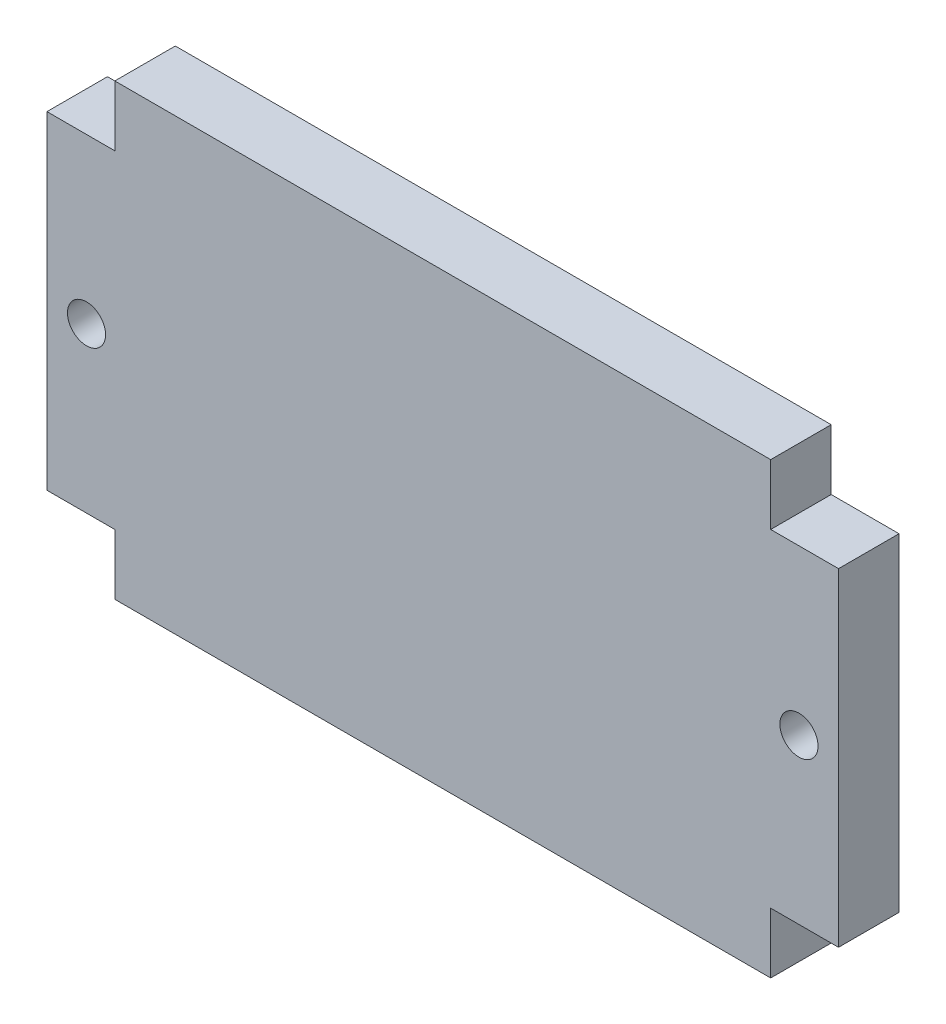
ISO-10303-21;
HEADER;
FILE_DESCRIPTION(('STEP AP214'),'2;1');
FILE_NAME('part.step','',(''),(''),'','','');
FILE_SCHEMA(('AUTOMOTIVE_DESIGN { 1 0 10303 214 1 1 1 1 }'));
ENDSEC;
DATA;
#1=APPLICATION_CONTEXT('core data for automotive mechanical design processes');
#2=APPLICATION_PROTOCOL_DEFINITION('international standard','automotive_design',2000,#1);
#3=PRODUCT_CONTEXT('',#1,'mechanical');
#4=PRODUCT('Part','Part','',(#3));
#5=PRODUCT_RELATED_PRODUCT_CATEGORY('part','',(#4));
#6=PRODUCT_DEFINITION_FORMATION('','',#4);
#7=PRODUCT_DEFINITION_CONTEXT('part definition',#1,'design');
#8=PRODUCT_DEFINITION('design','',#6,#7);
#9=PRODUCT_DEFINITION_SHAPE('','',#8);
#10=(LENGTH_UNIT() NAMED_UNIT(*) SI_UNIT(.MILLI.,.METRE.));
#11=(NAMED_UNIT(*) PLANE_ANGLE_UNIT() SI_UNIT($,.RADIAN.));
#12=(NAMED_UNIT(*) SI_UNIT($,.STERADIAN.) SOLID_ANGLE_UNIT());
#13=UNCERTAINTY_MEASURE_WITH_UNIT(LENGTH_MEASURE(1.E-05),#10,'distance_accuracy_value','');
#14=(GEOMETRIC_REPRESENTATION_CONTEXT(3) GLOBAL_UNCERTAINTY_ASSIGNED_CONTEXT((#13)) GLOBAL_UNIT_ASSIGNED_CONTEXT((#10,
#11,#12)) REPRESENTATION_CONTEXT('',''));
#15=CARTESIAN_POINT('',(0.,0.,0.));
#16=DIRECTION('',(0.,0.,1.));
#17=DIRECTION('',(1.,0.,0.));
#18=AXIS2_PLACEMENT_3D('',#15,#16,#17);
#19=CARTESIAN_POINT('',(0.,0.,5.35));
#20=DIRECTION('',(0.,0.,-1.));
#21=DIRECTION('',(-1.,0.,0.));
#22=AXIS2_PLACEMENT_3D('',#19,#20,#21);
#23=PLANE('',#22);
#24=DIRECTION('',(1.,0.,0.));
#25=VECTOR('',#24,1.);
#26=CARTESIAN_POINT('',(0.,5.3500011563,5.35));
#27=LINE('',#26,#25);
#28=CARTESIAN_POINT('',(0.,5.3500011563,5.35));
#29=VERTEX_POINT('',#28);
#30=CARTESIAN_POINT('',(5.99999725809999,5.3500011563,5.35));
#31=VERTEX_POINT('',#30);
#32=EDGE_CURVE('E177',#29,#31,#27,.T.);
#33=ORIENTED_EDGE('',*,*,#32,.T.);
#34=DIRECTION('',(0.,-1.,0.));
#35=VECTOR('',#34,1.);
#36=CARTESIAN_POINT('',(5.99999725809999,5.3500011563,5.35));
#37=LINE('',#36,#35);
#38=CARTESIAN_POINT('',(5.99999725809999,0.,5.35));
#39=VERTEX_POINT('',#38);
#40=EDGE_CURVE('E105',#31,#39,#37,.T.);
#41=ORIENTED_EDGE('',*,*,#40,.T.);
#42=DIRECTION('',(1.,0.,0.));
#43=VECTOR('',#42,1.);
#44=CARTESIAN_POINT('',(5.99999725809999,0.,5.35));
#45=LINE('',#44,#43);
#46=CARTESIAN_POINT('',(64.0000002458,0.,5.35));
#47=VERTEX_POINT('',#46);
#48=EDGE_CURVE('E204',#39,#47,#45,.T.);
#49=ORIENTED_EDGE('',*,*,#48,.T.);
#50=DIRECTION('',(0.,1.,0.));
#51=VECTOR('',#50,1.);
#52=CARTESIAN_POINT('',(64.0000002458,0.,5.35));
#53=LINE('',#52,#51);
#54=CARTESIAN_POINT('',(64.0000002458,5.3500011563,5.35));
#55=VERTEX_POINT('',#54);
#56=EDGE_CURVE('E223',#47,#55,#53,.T.);
#57=ORIENTED_EDGE('',*,*,#56,.T.);
#58=DIRECTION('',(1.,0.,0.));
#59=VECTOR('',#58,1.);
#60=CARTESIAN_POINT('',(64.0000002458,5.3500011563,5.35));
#61=LINE('',#60,#59);
#62=CARTESIAN_POINT('',(70.000000298,5.3500011563,5.35));
#63=VERTEX_POINT('',#62);
#64=EDGE_CURVE('E220',#55,#63,#61,.T.);
#65=ORIENTED_EDGE('',*,*,#64,.T.);
#66=DIRECTION('',(0.,1.,0.));
#67=VECTOR('',#66,1.);
#68=CARTESIAN_POINT('',(70.000000298,5.3500011563,5.35));
#69=LINE('',#68,#67);
#70=CARTESIAN_POINT('',(70.000000298,34.3500003218,5.35));
#71=VERTEX_POINT('',#70);
#72=EDGE_CURVE('E222',#63,#71,#69,.T.);
#73=ORIENTED_EDGE('',*,*,#72,.T.);
#74=DIRECTION('',(-1.,0.,0.));
#75=VECTOR('',#74,1.);
#76=CARTESIAN_POINT('',(70.000000298,34.3500003218,5.35));
#77=LINE('',#76,#75);
#78=CARTESIAN_POINT('',(64.0000002458,34.3500003218,5.35));
#79=VERTEX_POINT('',#78);
#80=EDGE_CURVE('E225',#71,#79,#77,.T.);
#81=ORIENTED_EDGE('',*,*,#80,.T.);
#82=DIRECTION('',(0.,1.,0.));
#83=VECTOR('',#82,1.);
#84=CARTESIAN_POINT('',(64.0000002458,34.3500003218,5.35));
#85=LINE('',#84,#83);
#86=CARTESIAN_POINT('',(64.0000002458,39.7000005468,5.35));
#87=VERTEX_POINT('',#86);
#88=EDGE_CURVE('E231',#79,#87,#85,.T.);
#89=ORIENTED_EDGE('',*,*,#88,.T.);
#90=DIRECTION('',(-1.,0.,0.));
#91=VECTOR('',#90,1.);
#92=CARTESIAN_POINT('',(64.0000002458,39.7000005468,5.35));
#93=LINE('',#92,#91);
#94=CARTESIAN_POINT('',(5.99999725809999,39.7000005468,5.35));
#95=VERTEX_POINT('',#94);
#96=EDGE_CURVE('E136',#87,#95,#93,.T.);
#97=ORIENTED_EDGE('',*,*,#96,.T.);
#98=DIRECTION('',(0.,-1.,0.));
#99=VECTOR('',#98,1.);
#100=CARTESIAN_POINT('',(5.99999725809999,39.7000005468,5.35));
#101=LINE('',#100,#99);
#102=CARTESIAN_POINT('',(5.99999725809999,34.3500003218,5.35));
#103=VERTEX_POINT('',#102);
#104=EDGE_CURVE('E130',#95,#103,#101,.T.);
#105=ORIENTED_EDGE('',*,*,#104,.T.);
#106=DIRECTION('',(-1.,0.,0.));
#107=VECTOR('',#106,1.);
#108=CARTESIAN_POINT('',(5.99999725809999,34.3500003218,5.35));
#109=LINE('',#108,#107);
#110=CARTESIAN_POINT('',(0.,34.3500003218,5.35));
#111=VERTEX_POINT('',#110);
#112=EDGE_CURVE('E134',#103,#111,#109,.T.);
#113=ORIENTED_EDGE('',*,*,#112,.T.);
#114=DIRECTION('',(0.,-1.,0.));
#115=VECTOR('',#114,1.);
#116=CARTESIAN_POINT('',(0.,34.3500003218,5.35));
#117=LINE('',#116,#115);
#118=EDGE_CURVE('E50',#111,#29,#117,.T.);
#119=ORIENTED_EDGE('',*,*,#118,.T.);
#120=EDGE_LOOP('',(#33,#41,#49,#57,#65,#73,#81,#89,#97,#105,#113,#119));
#121=FACE_BOUND('',#120,.T.);
#122=CARTESIAN_POINT('',(66.500000298,19.8500003218,5.35));
#123=DIRECTION('',(0.,0.,1.));
#124=DIRECTION('',(1.,0.,0.));
#125=AXIS2_PLACEMENT_3D('',#122,#123,#124);
#126=CIRCLE('',#125,1.685);
#127=CARTESIAN_POINT('',(68.185000298,19.8500003218,5.35));
#128=VERTEX_POINT('',#127);
#129=EDGE_CURVE('E158',#128,#128,#126,.T.);
#130=ORIENTED_EDGE('',*,*,#129,.F.);
#131=EDGE_LOOP('',(#130));
#132=FACE_BOUND('',#131,.T.);
#133=CARTESIAN_POINT('',(3.50000029799999,19.8500003218,5.35));
#134=DIRECTION('',(0.,0.,1.));
#135=DIRECTION('',(1.,0.,0.));
#136=AXIS2_PLACEMENT_3D('',#133,#134,#135);
#137=CIRCLE('',#136,1.68500000000001);
#138=CARTESIAN_POINT('',(5.18500029799999,19.8500003218,5.35));
#139=VERTEX_POINT('',#138);
#140=EDGE_CURVE('E272',#139,#139,#137,.T.);
#141=ORIENTED_EDGE('',*,*,#140,.F.);
#142=EDGE_LOOP('',(#141));
#143=FACE_BOUND('',#142,.T.);
#144=ADVANCED_FACE('F33',(#121,#132,#143),#23,.F.);
#145=CARTESIAN_POINT('',(0.,0.,0.));
#146=DIRECTION('',(0.,0.,-1.));
#147=DIRECTION('',(-1.,0.,0.));
#148=AXIS2_PLACEMENT_3D('',#145,#146,#147);
#149=PLANE('',#148);
#150=CARTESIAN_POINT('',(66.500000298,19.8500003218,0.));
#151=DIRECTION('',(0.,0.,1.));
#152=DIRECTION('',(1.,0.,0.));
#153=AXIS2_PLACEMENT_3D('',#150,#151,#152);
#154=CIRCLE('',#153,1.685);
#155=CARTESIAN_POINT('',(68.185000298,19.8500003218,0.));
#156=VERTEX_POINT('',#155);
#157=EDGE_CURVE('E277',#156,#156,#154,.T.);
#158=ORIENTED_EDGE('',*,*,#157,.T.);
#159=EDGE_LOOP('',(#158));
#160=FACE_BOUND('',#159,.T.);
#161=DIRECTION('',(1.,0.,0.));
#162=VECTOR('',#161,1.);
#163=CARTESIAN_POINT('',(0.,5.3500011563,0.));
#164=LINE('',#163,#162);
#165=CARTESIAN_POINT('',(0.,5.3500011563,0.));
#166=VERTEX_POINT('',#165);
#167=CARTESIAN_POINT('',(5.99999725809999,5.3500011563,0.));
#168=VERTEX_POINT('',#167);
#169=EDGE_CURVE('E154',#166,#168,#164,.T.);
#170=ORIENTED_EDGE('',*,*,#169,.F.);
#171=DIRECTION('',(0.,-1.,0.));
#172=VECTOR('',#171,1.);
#173=CARTESIAN_POINT('',(0.,34.3500003218,0.));
#174=LINE('',#173,#172);
#175=CARTESIAN_POINT('',(0.,34.3500003218,0.));
#176=VERTEX_POINT('',#175);
#177=EDGE_CURVE('E97',#176,#166,#174,.T.);
#178=ORIENTED_EDGE('',*,*,#177,.F.);
#179=DIRECTION('',(-1.,0.,0.));
#180=VECTOR('',#179,1.);
#181=CARTESIAN_POINT('',(5.99999725809999,34.3500003218,0.));
#182=LINE('',#181,#180);
#183=CARTESIAN_POINT('',(5.99999725809999,34.3500003218,0.));
#184=VERTEX_POINT('',#183);
#185=EDGE_CURVE('E91',#184,#176,#182,.T.);
#186=ORIENTED_EDGE('',*,*,#185,.F.);
#187=DIRECTION('',(0.,-1.,0.));
#188=VECTOR('',#187,1.);
#189=CARTESIAN_POINT('',(5.99999725809999,39.7000005468,0.));
#190=LINE('',#189,#188);
#191=CARTESIAN_POINT('',(5.99999725809999,39.7000005468,0.));
#192=VERTEX_POINT('',#191);
#193=EDGE_CURVE('E144',#192,#184,#190,.T.);
#194=ORIENTED_EDGE('',*,*,#193,.F.);
#195=DIRECTION('',(-1.,0.,0.));
#196=VECTOR('',#195,1.);
#197=CARTESIAN_POINT('',(64.0000002458,39.7000005468,0.));
#198=LINE('',#197,#196);
#199=CARTESIAN_POINT('',(64.0000002458,39.7000005468,0.));
#200=VERTEX_POINT('',#199);
#201=EDGE_CURVE('E172',#200,#192,#198,.T.);
#202=ORIENTED_EDGE('',*,*,#201,.F.);
#203=DIRECTION('',(0.,1.,0.));
#204=VECTOR('',#203,1.);
#205=CARTESIAN_POINT('',(64.0000002458,34.3500003218,0.));
#206=LINE('',#205,#204);
#207=CARTESIAN_POINT('',(64.0000002458,34.3500003218,0.));
#208=VERTEX_POINT('',#207);
#209=EDGE_CURVE('E170',#208,#200,#206,.T.);
#210=ORIENTED_EDGE('',*,*,#209,.F.);
#211=DIRECTION('',(-1.,0.,0.));
#212=VECTOR('',#211,1.);
#213=CARTESIAN_POINT('',(70.000000298,34.3500003218,0.));
#214=LINE('',#213,#212);
#215=CARTESIAN_POINT('',(70.000000298,34.3500003218,0.));
#216=VERTEX_POINT('',#215);
#217=EDGE_CURVE('E168',#216,#208,#214,.T.);
#218=ORIENTED_EDGE('',*,*,#217,.F.);
#219=DIRECTION('',(0.,1.,0.));
#220=VECTOR('',#219,1.);
#221=CARTESIAN_POINT('',(70.000000298,5.3500011563,0.));
#222=LINE('',#221,#220);
#223=CARTESIAN_POINT('',(70.000000298,5.3500011563,0.));
#224=VERTEX_POINT('',#223);
#225=EDGE_CURVE('E166',#224,#216,#222,.T.);
#226=ORIENTED_EDGE('',*,*,#225,.F.);
#227=DIRECTION('',(1.,0.,0.));
#228=VECTOR('',#227,1.);
#229=CARTESIAN_POINT('',(64.0000002458,5.3500011563,0.));
#230=LINE('',#229,#228);
#231=CARTESIAN_POINT('',(64.0000002458,5.3500011563,0.));
#232=VERTEX_POINT('',#231);
#233=EDGE_CURVE('E164',#232,#224,#230,.T.);
#234=ORIENTED_EDGE('',*,*,#233,.F.);
#235=DIRECTION('',(0.,1.,0.));
#236=VECTOR('',#235,1.);
#237=CARTESIAN_POINT('',(64.0000002458,0.,0.));
#238=LINE('',#237,#236);
#239=CARTESIAN_POINT('',(64.0000002458,0.,0.));
#240=VERTEX_POINT('',#239);
#241=EDGE_CURVE('E162',#240,#232,#238,.T.);
#242=ORIENTED_EDGE('',*,*,#241,.F.);
#243=DIRECTION('',(1.,0.,0.));
#244=VECTOR('',#243,1.);
#245=CARTESIAN_POINT('',(5.99999725809999,0.,0.));
#246=LINE('',#245,#244);
#247=CARTESIAN_POINT('',(5.99999725809999,0.,0.));
#248=VERTEX_POINT('',#247);
#249=EDGE_CURVE('E160',#248,#240,#246,.T.);
#250=ORIENTED_EDGE('',*,*,#249,.F.);
#251=DIRECTION('',(0.,-1.,0.));
#252=VECTOR('',#251,1.);
#253=CARTESIAN_POINT('',(5.99999725809999,5.3500011563,0.));
#254=LINE('',#253,#252);
#255=EDGE_CURVE('E157',#168,#248,#254,.T.);
#256=ORIENTED_EDGE('',*,*,#255,.F.);
#257=EDGE_LOOP('',(#170,#178,#186,#194,#202,#210,#218,#226,#234,#242,#250,#256));
#258=FACE_BOUND('',#257,.T.);
#259=CARTESIAN_POINT('',(3.50000029799999,19.8500003218,0.));
#260=DIRECTION('',(0.,0.,1.));
#261=DIRECTION('',(1.,0.,0.));
#262=AXIS2_PLACEMENT_3D('',#259,#260,#261);
#263=CIRCLE('',#262,1.68500000000001);
#264=CARTESIAN_POINT('',(5.18500029799999,19.8500003218,0.));
#265=VERTEX_POINT('',#264);
#266=EDGE_CURVE('E275',#265,#265,#263,.T.);
#267=ORIENTED_EDGE('',*,*,#266,.T.);
#268=EDGE_LOOP('',(#267));
#269=FACE_BOUND('',#268,.T.);
#270=ADVANCED_FACE('F208',(#160,#258,#269),#149,.T.);
#271=CARTESIAN_POINT('',(0.,5.3500011563,5.35));
#272=DIRECTION('',(0.,1.,0.));
#273=DIRECTION('',(0.,0.,1.));
#274=AXIS2_PLACEMENT_3D('',#271,#272,#273);
#275=PLANE('',#274);
#276=ORIENTED_EDGE('',*,*,#169,.T.);
#277=DIRECTION('',(0.,0.,-1.));
#278=VECTOR('',#277,1.);
#279=CARTESIAN_POINT('',(5.99999725809999,5.3500011563,5.35));
#280=LINE('',#279,#278);
#281=EDGE_CURVE('E11',#31,#168,#280,.T.);
#282=ORIENTED_EDGE('',*,*,#281,.F.);
#283=ORIENTED_EDGE('',*,*,#32,.F.);
#284=DIRECTION('',(0.,0.,-1.));
#285=VECTOR('',#284,1.);
#286=CARTESIAN_POINT('',(0.,5.3500011563,5.35));
#287=LINE('',#286,#285);
#288=EDGE_CURVE('E150',#29,#166,#287,.T.);
#289=ORIENTED_EDGE('',*,*,#288,.T.);
#290=EDGE_LOOP('',(#276,#282,#283,#289));
#291=FACE_BOUND('',#290,.T.);
#292=ADVANCED_FACE('F35',(#291),#275,.F.);
#293=CARTESIAN_POINT('',(5.99999725809999,5.3500011563,5.35));
#294=DIRECTION('',(1.,0.,0.));
#295=DIRECTION('',(0.,0.,-1.));
#296=AXIS2_PLACEMENT_3D('',#293,#294,#295);
#297=PLANE('',#296);
#298=ORIENTED_EDGE('',*,*,#255,.T.);
#299=DIRECTION('',(0.,0.,-1.));
#300=VECTOR('',#299,1.);
#301=CARTESIAN_POINT('',(5.99999725809999,0.,5.35));
#302=LINE('',#301,#300);
#303=EDGE_CURVE('E42',#39,#248,#302,.T.);
#304=ORIENTED_EDGE('',*,*,#303,.F.);
#305=ORIENTED_EDGE('',*,*,#40,.F.);
#306=ORIENTED_EDGE('',*,*,#281,.T.);
#307=EDGE_LOOP('',(#298,#304,#305,#306));
#308=FACE_BOUND('',#307,.T.);
#309=ADVANCED_FACE('F372',(#308),#297,.F.);
#310=CARTESIAN_POINT('',(5.99999725809999,0.,5.35));
#311=DIRECTION('',(0.,1.,0.));
#312=DIRECTION('',(0.,0.,1.));
#313=AXIS2_PLACEMENT_3D('',#310,#311,#312);
#314=PLANE('',#313);
#315=ORIENTED_EDGE('',*,*,#249,.T.);
#316=DIRECTION('',(0.,0.,-1.));
#317=VECTOR('',#316,1.);
#318=CARTESIAN_POINT('',(64.0000002458,0.,5.35));
#319=LINE('',#318,#317);
#320=EDGE_CURVE('E196',#47,#240,#319,.T.);
#321=ORIENTED_EDGE('',*,*,#320,.F.);
#322=ORIENTED_EDGE('',*,*,#48,.F.);
#323=ORIENTED_EDGE('',*,*,#303,.T.);
#324=EDGE_LOOP('',(#315,#321,#322,#323));
#325=FACE_BOUND('',#324,.T.);
#326=ADVANCED_FACE('F202',(#325),#314,.F.);
#327=CARTESIAN_POINT('',(64.0000002458,0.,5.35));
#328=DIRECTION('',(-1.,0.,0.));
#329=DIRECTION('',(0.,0.,1.));
#330=AXIS2_PLACEMENT_3D('',#327,#328,#329);
#331=PLANE('',#330);
#332=ORIENTED_EDGE('',*,*,#241,.T.);
#333=DIRECTION('',(0.,0.,-1.));
#334=VECTOR('',#333,1.);
#335=CARTESIAN_POINT('',(64.0000002458,5.3500011563,5.35));
#336=LINE('',#335,#334);
#337=EDGE_CURVE('E193',#55,#232,#336,.T.);
#338=ORIENTED_EDGE('',*,*,#337,.F.);
#339=ORIENTED_EDGE('',*,*,#56,.F.);
#340=ORIENTED_EDGE('',*,*,#320,.T.);
#341=EDGE_LOOP('',(#332,#338,#339,#340));
#342=FACE_BOUND('',#341,.T.);
#343=ADVANCED_FACE('F214',(#342),#331,.F.);
#344=CARTESIAN_POINT('',(64.0000002458,5.3500011563,5.35));
#345=DIRECTION('',(0.,1.,0.));
#346=DIRECTION('',(0.,0.,1.));
#347=AXIS2_PLACEMENT_3D('',#344,#345,#346);
#348=PLANE('',#347);
#349=ORIENTED_EDGE('',*,*,#233,.T.);
#350=DIRECTION('',(0.,0.,-1.));
#351=VECTOR('',#350,1.);
#352=CARTESIAN_POINT('',(70.000000298,5.3500011563,5.35));
#353=LINE('',#352,#351);
#354=EDGE_CURVE('E190',#63,#224,#353,.T.);
#355=ORIENTED_EDGE('',*,*,#354,.F.);
#356=ORIENTED_EDGE('',*,*,#64,.F.);
#357=ORIENTED_EDGE('',*,*,#337,.T.);
#358=EDGE_LOOP('',(#349,#355,#356,#357));
#359=FACE_BOUND('',#358,.T.);
#360=ADVANCED_FACE('F218',(#359),#348,.F.);
#361=CARTESIAN_POINT('',(70.000000298,5.3500011563,5.35));
#362=DIRECTION('',(-1.,0.,0.));
#363=DIRECTION('',(0.,0.,1.));
#364=AXIS2_PLACEMENT_3D('',#361,#362,#363);
#365=PLANE('',#364);
#366=ORIENTED_EDGE('',*,*,#225,.T.);
#367=DIRECTION('',(0.,0.,-1.));
#368=VECTOR('',#367,1.);
#369=CARTESIAN_POINT('',(70.000000298,34.3500003218,5.35));
#370=LINE('',#369,#368);
#371=EDGE_CURVE('E187',#71,#216,#370,.T.);
#372=ORIENTED_EDGE('',*,*,#371,.F.);
#373=ORIENTED_EDGE('',*,*,#72,.F.);
#374=ORIENTED_EDGE('',*,*,#354,.T.);
#375=EDGE_LOOP('',(#366,#372,#373,#374));
#376=FACE_BOUND('',#375,.T.);
#377=ADVANCED_FACE('F337',(#376),#365,.F.);
#378=CARTESIAN_POINT('',(70.000000298,34.3500003218,5.35));
#379=DIRECTION('',(0.,-1.,0.));
#380=DIRECTION('',(0.,0.,-1.));
#381=AXIS2_PLACEMENT_3D('',#378,#379,#380);
#382=PLANE('',#381);
#383=ORIENTED_EDGE('',*,*,#217,.T.);
#384=DIRECTION('',(0.,0.,-1.));
#385=VECTOR('',#384,1.);
#386=CARTESIAN_POINT('',(64.0000002458,34.3500003218,5.35));
#387=LINE('',#386,#385);
#388=EDGE_CURVE('E184',#79,#208,#387,.T.);
#389=ORIENTED_EDGE('',*,*,#388,.F.);
#390=ORIENTED_EDGE('',*,*,#80,.F.);
#391=ORIENTED_EDGE('',*,*,#371,.T.);
#392=EDGE_LOOP('',(#383,#389,#390,#391));
#393=FACE_BOUND('',#392,.T.);
#394=ADVANCED_FACE('F328',(#393),#382,.F.);
#395=CARTESIAN_POINT('',(64.0000002458,34.3500003218,5.35));
#396=DIRECTION('',(-1.,0.,0.));
#397=DIRECTION('',(0.,0.,1.));
#398=AXIS2_PLACEMENT_3D('',#395,#396,#397);
#399=PLANE('',#398);
#400=ORIENTED_EDGE('',*,*,#209,.T.);
#401=DIRECTION('',(0.,0.,-1.));
#402=VECTOR('',#401,1.);
#403=CARTESIAN_POINT('',(64.0000002458,39.7000005468,5.35));
#404=LINE('',#403,#402);
#405=EDGE_CURVE('E181',#87,#200,#404,.T.);
#406=ORIENTED_EDGE('',*,*,#405,.F.);
#407=ORIENTED_EDGE('',*,*,#88,.F.);
#408=ORIENTED_EDGE('',*,*,#388,.T.);
#409=EDGE_LOOP('',(#400,#406,#407,#408));
#410=FACE_BOUND('',#409,.T.);
#411=ADVANCED_FACE('F237',(#410),#399,.F.);
#412=CARTESIAN_POINT('',(64.0000002458,39.7000005468,5.35));
#413=DIRECTION('',(0.,-1.,0.));
#414=DIRECTION('',(0.,0.,-1.));
#415=AXIS2_PLACEMENT_3D('',#412,#413,#414);
#416=PLANE('',#415);
#417=ORIENTED_EDGE('',*,*,#201,.T.);
#418=DIRECTION('',(0.,0.,-1.));
#419=VECTOR('',#418,1.);
#420=CARTESIAN_POINT('',(5.99999725809999,39.7000005468,5.35));
#421=LINE('',#420,#419);
#422=EDGE_CURVE('E145',#95,#192,#421,.T.);
#423=ORIENTED_EDGE('',*,*,#422,.F.);
#424=ORIENTED_EDGE('',*,*,#96,.F.);
#425=ORIENTED_EDGE('',*,*,#405,.T.);
#426=EDGE_LOOP('',(#417,#423,#424,#425));
#427=FACE_BOUND('',#426,.T.);
#428=ADVANCED_FACE('F241',(#427),#416,.F.);
#429=CARTESIAN_POINT('',(5.99999725809999,39.7000005468,5.35));
#430=DIRECTION('',(1.,0.,0.));
#431=DIRECTION('',(0.,0.,-1.));
#432=AXIS2_PLACEMENT_3D('',#429,#430,#431);
#433=PLANE('',#432);
#434=ORIENTED_EDGE('',*,*,#193,.T.);
#435=DIRECTION('',(0.,0.,-1.));
#436=VECTOR('',#435,1.);
#437=CARTESIAN_POINT('',(5.99999725809999,34.3500003218,5.35));
#438=LINE('',#437,#436);
#439=EDGE_CURVE('E141',#103,#184,#438,.T.);
#440=ORIENTED_EDGE('',*,*,#439,.F.);
#441=ORIENTED_EDGE('',*,*,#104,.F.);
#442=ORIENTED_EDGE('',*,*,#422,.T.);
#443=EDGE_LOOP('',(#434,#440,#441,#442));
#444=FACE_BOUND('',#443,.T.);
#445=ADVANCED_FACE('F142',(#444),#433,.F.);
#446=CARTESIAN_POINT('',(5.99999725809999,34.3500003218,5.35));
#447=DIRECTION('',(0.,-1.,0.));
#448=DIRECTION('',(0.,0.,-1.));
#449=AXIS2_PLACEMENT_3D('',#446,#447,#448);
#450=PLANE('',#449);
#451=ORIENTED_EDGE('',*,*,#185,.T.);
#452=DIRECTION('',(0.,0.,-1.));
#453=VECTOR('',#452,1.);
#454=CARTESIAN_POINT('',(0.,34.3500003218,5.35));
#455=LINE('',#454,#453);
#456=EDGE_CURVE('E146',#111,#176,#455,.T.);
#457=ORIENTED_EDGE('',*,*,#456,.F.);
#458=ORIENTED_EDGE('',*,*,#112,.F.);
#459=ORIENTED_EDGE('',*,*,#439,.T.);
#460=EDGE_LOOP('',(#451,#457,#458,#459));
#461=FACE_BOUND('',#460,.T.);
#462=ADVANCED_FACE('F148',(#461),#450,.F.);
#463=CARTESIAN_POINT('',(0.,34.3500003218,5.35));
#464=DIRECTION('',(1.,0.,0.));
#465=DIRECTION('',(0.,0.,-1.));
#466=AXIS2_PLACEMENT_3D('',#463,#464,#465);
#467=PLANE('',#466);
#468=ORIENTED_EDGE('',*,*,#177,.T.);
#469=ORIENTED_EDGE('',*,*,#288,.F.);
#470=ORIENTED_EDGE('',*,*,#118,.F.);
#471=ORIENTED_EDGE('',*,*,#456,.T.);
#472=EDGE_LOOP('',(#468,#469,#470,#471));
#473=FACE_BOUND('',#472,.T.);
#474=ADVANCED_FACE('F245',(#473),#467,.F.);
#475=CARTESIAN_POINT('',(66.500000298,19.8500003218,5.35));
#476=DIRECTION('',(0.,0.,-1.));
#477=DIRECTION('',(-1.,0.,0.));
#478=AXIS2_PLACEMENT_3D('',#475,#476,#477);
#479=CYLINDRICAL_SURFACE('',#478,1.685);
#480=ORIENTED_EDGE('',*,*,#129,.T.);
#481=EDGE_LOOP('',(#480));
#482=FACE_BOUND('',#481,.T.);
#483=ORIENTED_EDGE('',*,*,#157,.F.);
#484=EDGE_LOOP('',(#483));
#485=FACE_BOUND('',#484,.T.);
#486=ADVANCED_FACE('F247',(#482,#485),#479,.F.);
#487=CARTESIAN_POINT('',(3.50000029799999,19.8500003218,5.35));
#488=DIRECTION('',(0.,0.,-1.));
#489=DIRECTION('',(-1.,0.,0.));
#490=AXIS2_PLACEMENT_3D('',#487,#488,#489);
#491=CYLINDRICAL_SURFACE('',#490,1.68500000000001);
#492=ORIENTED_EDGE('',*,*,#140,.T.);
#493=EDGE_LOOP('',(#492));
#494=FACE_BOUND('',#493,.T.);
#495=ORIENTED_EDGE('',*,*,#266,.F.);
#496=EDGE_LOOP('',(#495));
#497=FACE_BOUND('',#496,.T.);
#498=ADVANCED_FACE('F253',(#494,#497),#491,.F.);
#499=CLOSED_SHELL('',(#144,#270,#292,#309,#326,#343,#360,#377,#394,#411,#428,#445,#462,#474,
#486,#498));
#500=MANIFOLD_SOLID_BREP('B2',#499);
#501=ADVANCED_BREP_SHAPE_REPRESENTATION('',(#18,#500),#14);
#502=SHAPE_DEFINITION_REPRESENTATION(#9,#501);
ENDSEC;
END-ISO-10303-21;
